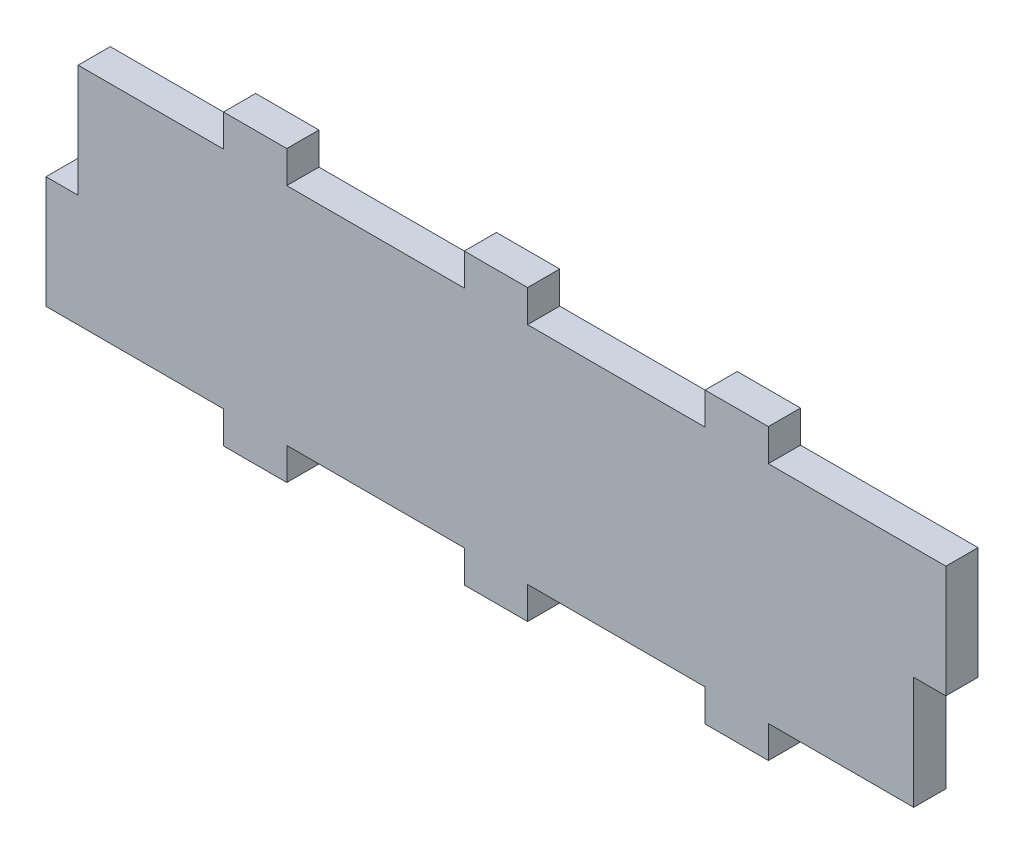
ISO-10303-21;
HEADER;
FILE_DESCRIPTION(('STEP AP214'),'2;1');
FILE_NAME('part.step','',(''),(''),'','','');
FILE_SCHEMA(('AUTOMOTIVE_DESIGN { 1 0 10303 214 1 1 1 1 }'));
ENDSEC;
DATA;
#1=APPLICATION_CONTEXT('core data for automotive mechanical design processes');
#2=APPLICATION_PROTOCOL_DEFINITION('international standard','automotive_design',2000,#1);
#3=PRODUCT_CONTEXT('',#1,'mechanical');
#4=PRODUCT('Part','Part','',(#3));
#5=PRODUCT_RELATED_PRODUCT_CATEGORY('part','',(#4));
#6=PRODUCT_DEFINITION_FORMATION('','',#4);
#7=PRODUCT_DEFINITION_CONTEXT('part definition',#1,'design');
#8=PRODUCT_DEFINITION('design','',#6,#7);
#9=PRODUCT_DEFINITION_SHAPE('','',#8);
#10=(LENGTH_UNIT() NAMED_UNIT(*) SI_UNIT(.MILLI.,.METRE.));
#11=(NAMED_UNIT(*) PLANE_ANGLE_UNIT() SI_UNIT($,.RADIAN.));
#12=(NAMED_UNIT(*) SI_UNIT($,.STERADIAN.) SOLID_ANGLE_UNIT());
#13=UNCERTAINTY_MEASURE_WITH_UNIT(LENGTH_MEASURE(1.E-05),#10,'distance_accuracy_value','');
#14=(GEOMETRIC_REPRESENTATION_CONTEXT(3) GLOBAL_UNCERTAINTY_ASSIGNED_CONTEXT((#13)) GLOBAL_UNIT_ASSIGNED_CONTEXT((#10,
#11,#12)) REPRESENTATION_CONTEXT('',''));
#15=CARTESIAN_POINT('',(0.,0.,0.));
#16=DIRECTION('',(0.,0.,1.));
#17=DIRECTION('',(1.,0.,0.));
#18=AXIS2_PLACEMENT_3D('',#15,#16,#17);
#19=CARTESIAN_POINT('',(0.,-17.5,5.));
#20=DIRECTION('',(0.,1.,0.));
#21=DIRECTION('',(-1.,0.,0.));
#22=AXIS2_PLACEMENT_3D('',#19,#20,#21);
#23=PLANE('',#22);
#24=DIRECTION('',(1.,0.,0.));
#25=VECTOR('',#24,1.);
#26=CARTESIAN_POINT('',(0.,-17.5,0.));
#27=LINE('',#26,#25);
#28=CARTESIAN_POINT('',(-70.,-17.5,0.));
#29=VERTEX_POINT('',#28);
#30=CARTESIAN_POINT('',(-42.3875,-17.5,0.));
#31=VERTEX_POINT('',#30);
#32=EDGE_CURVE('E281',#29,#31,#27,.T.);
#33=ORIENTED_EDGE('',*,*,#32,.T.);
#34=DIRECTION('',(0.,0.,-1.));
#35=VECTOR('',#34,1.);
#36=CARTESIAN_POINT('',(-42.3875,-17.5,5.));
#37=LINE('',#36,#35);
#38=CARTESIAN_POINT('',(-42.3875,-17.5,5.));
#39=VERTEX_POINT('',#38);
#40=EDGE_CURVE('E11',#39,#31,#37,.T.);
#41=ORIENTED_EDGE('',*,*,#40,.F.);
#42=DIRECTION('',(1.,0.,0.));
#43=VECTOR('',#42,1.);
#44=CARTESIAN_POINT('',(0.,-17.5,5.));
#45=LINE('',#44,#43);
#46=CARTESIAN_POINT('',(-70.,-17.5,5.));
#47=VERTEX_POINT('',#46);
#48=EDGE_CURVE('E357',#47,#39,#45,.T.);
#49=ORIENTED_EDGE('',*,*,#48,.F.);
#50=DIRECTION('',(0.,0.,-1.));
#51=VECTOR('',#50,1.);
#52=CARTESIAN_POINT('',(-70.,-17.5,5.));
#53=LINE('',#52,#51);
#54=EDGE_CURVE('E52',#47,#29,#53,.T.);
#55=ORIENTED_EDGE('',*,*,#54,.T.);
#56=EDGE_LOOP('',(#33,#41,#49,#55));
#57=FACE_BOUND('',#56,.T.);
#58=ADVANCED_FACE('F35',(#57),#23,.F.);
#59=CARTESIAN_POINT('',(-42.3875,0.,5.));
#60=DIRECTION('',(1.,0.,0.));
#61=DIRECTION('',(0.,0.,-1.));
#62=AXIS2_PLACEMENT_3D('',#59,#60,#61);
#63=PLANE('',#62);
#64=DIRECTION('',(0.,-1.,0.));
#65=VECTOR('',#64,1.);
#66=CARTESIAN_POINT('',(-42.3875,0.,0.));
#67=LINE('',#66,#65);
#68=CARTESIAN_POINT('',(-42.3875,-22.5,0.));
#69=VERTEX_POINT('',#68);
#70=EDGE_CURVE('E283',#31,#69,#67,.T.);
#71=ORIENTED_EDGE('',*,*,#70,.T.);
#72=DIRECTION('',(0.,0.,-1.));
#73=VECTOR('',#72,1.);
#74=CARTESIAN_POINT('',(-42.3875,-22.5,5.));
#75=LINE('',#74,#73);
#76=CARTESIAN_POINT('',(-42.3875,-22.5,5.));
#77=VERTEX_POINT('',#76);
#78=EDGE_CURVE('E44',#77,#69,#75,.T.);
#79=ORIENTED_EDGE('',*,*,#78,.F.);
#80=DIRECTION('',(0.,-1.,0.));
#81=VECTOR('',#80,1.);
#82=CARTESIAN_POINT('',(-42.3875,0.,5.));
#83=LINE('',#82,#81);
#84=EDGE_CURVE('E163',#39,#77,#83,.T.);
#85=ORIENTED_EDGE('',*,*,#84,.F.);
#86=ORIENTED_EDGE('',*,*,#40,.T.);
#87=EDGE_LOOP('',(#71,#79,#85,#86));
#88=FACE_BOUND('',#87,.T.);
#89=ADVANCED_FACE('F37',(#88),#63,.F.);
#90=CARTESIAN_POINT('',(0.,-22.5,5.));
#91=DIRECTION('',(0.,1.,0.));
#92=DIRECTION('',(0.,0.,1.));
#93=AXIS2_PLACEMENT_3D('',#90,#91,#92);
#94=PLANE('',#93);
#95=DIRECTION('',(1.,0.,0.));
#96=VECTOR('',#95,1.);
#97=CARTESIAN_POINT('',(0.,-22.5,0.));
#98=LINE('',#97,#96);
#99=CARTESIAN_POINT('',(-32.5375,-22.5,0.));
#100=VERTEX_POINT('',#99);
#101=EDGE_CURVE('E287',#69,#100,#98,.T.);
#102=ORIENTED_EDGE('',*,*,#101,.T.);
#103=DIRECTION('',(0.,0.,-1.));
#104=VECTOR('',#103,1.);
#105=CARTESIAN_POINT('',(-32.5375,-22.5,5.));
#106=LINE('',#105,#104);
#107=CARTESIAN_POINT('',(-32.5375,-22.5,5.));
#108=VERTEX_POINT('',#107);
#109=EDGE_CURVE('E417',#108,#100,#106,.T.);
#110=ORIENTED_EDGE('',*,*,#109,.F.);
#111=DIRECTION('',(1.,0.,0.));
#112=VECTOR('',#111,1.);
#113=CARTESIAN_POINT('',(0.,-22.5,5.));
#114=LINE('',#113,#112);
#115=EDGE_CURVE('E424',#77,#108,#114,.T.);
#116=ORIENTED_EDGE('',*,*,#115,.F.);
#117=ORIENTED_EDGE('',*,*,#78,.T.);
#118=EDGE_LOOP('',(#102,#110,#116,#117));
#119=FACE_BOUND('',#118,.T.);
#120=ADVANCED_FACE('F422',(#119),#94,.F.);
#121=CARTESIAN_POINT('',(-32.5375,0.,5.));
#122=DIRECTION('',(1.,0.,0.));
#123=DIRECTION('',(0.,0.,-1.));
#124=AXIS2_PLACEMENT_3D('',#121,#122,#123);
#125=PLANE('',#124);
#126=DIRECTION('',(0.,-1.,0.));
#127=VECTOR('',#126,1.);
#128=CARTESIAN_POINT('',(-32.5375,0.,0.));
#129=LINE('',#128,#127);
#130=CARTESIAN_POINT('',(-32.5375,-17.5,0.));
#131=VERTEX_POINT('',#130);
#132=EDGE_CURVE('E290',#131,#100,#129,.T.);
#133=ORIENTED_EDGE('',*,*,#132,.F.);
#134=DIRECTION('',(0.,0.,-1.));
#135=VECTOR('',#134,1.);
#136=CARTESIAN_POINT('',(-32.5375,-17.5,5.));
#137=LINE('',#136,#135);
#138=CARTESIAN_POINT('',(-32.5375,-17.5,5.));
#139=VERTEX_POINT('',#138);
#140=EDGE_CURVE('E415',#139,#131,#137,.T.);
#141=ORIENTED_EDGE('',*,*,#140,.F.);
#142=DIRECTION('',(0.,-1.,0.));
#143=VECTOR('',#142,1.);
#144=CARTESIAN_POINT('',(-32.5375,0.,5.));
#145=LINE('',#144,#143);
#146=EDGE_CURVE('E435',#139,#108,#145,.T.);
#147=ORIENTED_EDGE('',*,*,#146,.T.);
#148=ORIENTED_EDGE('',*,*,#109,.T.);
#149=EDGE_LOOP('',(#133,#141,#147,#148));
#150=FACE_BOUND('',#149,.T.);
#151=ADVANCED_FACE('F431',(#150),#125,.T.);
#152=CARTESIAN_POINT('',(-4.92499999999999,-17.5,0.));
#153=VERTEX_POINT('',#152);
#154=EDGE_CURVE('E285',#131,#153,#27,.T.);
#155=ORIENTED_EDGE('',*,*,#154,.T.);
#156=DIRECTION('',(0.,0.,-1.));
#157=VECTOR('',#156,1.);
#158=CARTESIAN_POINT('',(-4.92499999999999,-17.5,5.));
#159=LINE('',#158,#157);
#160=CARTESIAN_POINT('',(-4.92499999999999,-17.5,5.));
#161=VERTEX_POINT('',#160);
#162=EDGE_CURVE('E412',#161,#153,#159,.T.);
#163=ORIENTED_EDGE('',*,*,#162,.F.);
#164=EDGE_CURVE('E436',#139,#161,#45,.T.);
#165=ORIENTED_EDGE('',*,*,#164,.F.);
#166=ORIENTED_EDGE('',*,*,#140,.T.);
#167=EDGE_LOOP('',(#155,#163,#165,#166));
#168=FACE_BOUND('',#167,.T.);
#169=ADVANCED_FACE('F511',(#168),#23,.F.);
#170=CARTESIAN_POINT('',(-4.92499999999999,0.,5.));
#171=DIRECTION('',(1.,0.,0.));
#172=DIRECTION('',(0.,0.,-1.));
#173=AXIS2_PLACEMENT_3D('',#170,#171,#172);
#174=PLANE('',#173);
#175=DIRECTION('',(0.,-1.,0.));
#176=VECTOR('',#175,1.);
#177=CARTESIAN_POINT('',(-4.92499999999999,0.,0.));
#178=LINE('',#177,#176);
#179=CARTESIAN_POINT('',(-4.92499999999999,-22.5,0.));
#180=VERTEX_POINT('',#179);
#181=EDGE_CURVE('E293',#153,#180,#178,.T.);
#182=ORIENTED_EDGE('',*,*,#181,.T.);
#183=DIRECTION('',(0.,0.,-1.));
#184=VECTOR('',#183,1.);
#185=CARTESIAN_POINT('',(-4.92499999999999,-22.5,5.));
#186=LINE('',#185,#184);
#187=CARTESIAN_POINT('',(-4.92499999999999,-22.5,5.));
#188=VERTEX_POINT('',#187);
#189=EDGE_CURVE('E409',#188,#180,#186,.T.);
#190=ORIENTED_EDGE('',*,*,#189,.F.);
#191=DIRECTION('',(0.,-1.,0.));
#192=VECTOR('',#191,1.);
#193=CARTESIAN_POINT('',(-4.92499999999999,0.,5.));
#194=LINE('',#193,#192);
#195=EDGE_CURVE('E438',#161,#188,#194,.T.);
#196=ORIENTED_EDGE('',*,*,#195,.F.);
#197=ORIENTED_EDGE('',*,*,#162,.T.);
#198=EDGE_LOOP('',(#182,#190,#196,#197));
#199=FACE_BOUND('',#198,.T.);
#200=ADVANCED_FACE('F519',(#199),#174,.F.);
#201=CARTESIAN_POINT('',(0.,-22.5,5.));
#202=DIRECTION('',(0.,1.,0.));
#203=DIRECTION('',(0.,0.,1.));
#204=AXIS2_PLACEMENT_3D('',#201,#202,#203);
#205=PLANE('',#204);
#206=DIRECTION('',(1.,0.,0.));
#207=VECTOR('',#206,1.);
#208=CARTESIAN_POINT('',(0.,-22.5,0.));
#209=LINE('',#208,#207);
#210=CARTESIAN_POINT('',(4.92500000000001,-22.5,0.));
#211=VERTEX_POINT('',#210);
#212=EDGE_CURVE('E295',#180,#211,#209,.T.);
#213=ORIENTED_EDGE('',*,*,#212,.T.);
#214=DIRECTION('',(0.,0.,-1.));
#215=VECTOR('',#214,1.);
#216=CARTESIAN_POINT('',(4.92500000000001,-22.5,5.));
#217=LINE('',#216,#215);
#218=CARTESIAN_POINT('',(4.92500000000001,-22.5,5.));
#219=VERTEX_POINT('',#218);
#220=EDGE_CURVE('E407',#219,#211,#217,.T.);
#221=ORIENTED_EDGE('',*,*,#220,.F.);
#222=DIRECTION('',(1.,0.,0.));
#223=VECTOR('',#222,1.);
#224=CARTESIAN_POINT('',(0.,-22.5,5.));
#225=LINE('',#224,#223);
#226=EDGE_CURVE('E445',#188,#219,#225,.T.);
#227=ORIENTED_EDGE('',*,*,#226,.F.);
#228=ORIENTED_EDGE('',*,*,#189,.T.);
#229=EDGE_LOOP('',(#213,#221,#227,#228));
#230=FACE_BOUND('',#229,.T.);
#231=ADVANCED_FACE('F544',(#230),#205,.F.);
#232=CARTESIAN_POINT('',(4.92500000000001,0.,5.));
#233=DIRECTION('',(1.,0.,0.));
#234=DIRECTION('',(0.,0.,-1.));
#235=AXIS2_PLACEMENT_3D('',#232,#233,#234);
#236=PLANE('',#235);
#237=DIRECTION('',(0.,-1.,0.));
#238=VECTOR('',#237,1.);
#239=CARTESIAN_POINT('',(4.92500000000001,0.,0.));
#240=LINE('',#239,#238);
#241=CARTESIAN_POINT('',(4.92500000000001,-17.5,0.));
#242=VERTEX_POINT('',#241);
#243=EDGE_CURVE('E298',#242,#211,#240,.T.);
#244=ORIENTED_EDGE('',*,*,#243,.F.);
#245=DIRECTION('',(0.,0.,-1.));
#246=VECTOR('',#245,1.);
#247=CARTESIAN_POINT('',(4.92500000000001,-17.5,5.));
#248=LINE('',#247,#246);
#249=CARTESIAN_POINT('',(4.92500000000001,-17.5,5.));
#250=VERTEX_POINT('',#249);
#251=EDGE_CURVE('E405',#250,#242,#248,.T.);
#252=ORIENTED_EDGE('',*,*,#251,.F.);
#253=DIRECTION('',(0.,-1.,0.));
#254=VECTOR('',#253,1.);
#255=CARTESIAN_POINT('',(4.92500000000001,0.,5.));
#256=LINE('',#255,#254);
#257=EDGE_CURVE('E447',#250,#219,#256,.T.);
#258=ORIENTED_EDGE('',*,*,#257,.T.);
#259=ORIENTED_EDGE('',*,*,#220,.T.);
#260=EDGE_LOOP('',(#244,#252,#258,#259));
#261=FACE_BOUND('',#260,.T.);
#262=ADVANCED_FACE('F536',(#261),#236,.T.);
#263=CARTESIAN_POINT('',(32.5375,-17.5,0.));
#264=VERTEX_POINT('',#263);
#265=EDGE_CURVE('E301',#242,#264,#27,.T.);
#266=ORIENTED_EDGE('',*,*,#265,.T.);
#267=DIRECTION('',(0.,0.,-1.));
#268=VECTOR('',#267,1.);
#269=CARTESIAN_POINT('',(32.5375,-17.5,5.));
#270=LINE('',#269,#268);
#271=CARTESIAN_POINT('',(32.5375,-17.5,5.));
#272=VERTEX_POINT('',#271);
#273=EDGE_CURVE('E402',#272,#264,#270,.T.);
#274=ORIENTED_EDGE('',*,*,#273,.F.);
#275=EDGE_CURVE('E440',#250,#272,#45,.T.);
#276=ORIENTED_EDGE('',*,*,#275,.F.);
#277=ORIENTED_EDGE('',*,*,#251,.T.);
#278=EDGE_LOOP('',(#266,#274,#276,#277));
#279=FACE_BOUND('',#278,.T.);
#280=ADVANCED_FACE('F521',(#279),#23,.F.);
#281=CARTESIAN_POINT('',(32.5375,0.,5.));
#282=DIRECTION('',(1.,0.,0.));
#283=DIRECTION('',(0.,0.,-1.));
#284=AXIS2_PLACEMENT_3D('',#281,#282,#283);
#285=PLANE('',#284);
#286=DIRECTION('',(0.,-1.,0.));
#287=VECTOR('',#286,1.);
#288=CARTESIAN_POINT('',(32.5375,0.,0.));
#289=LINE('',#288,#287);
#290=CARTESIAN_POINT('',(32.5375,-22.5,0.));
#291=VERTEX_POINT('',#290);
#292=EDGE_CURVE('E302',#264,#291,#289,.T.);
#293=ORIENTED_EDGE('',*,*,#292,.T.);
#294=DIRECTION('',(0.,0.,-1.));
#295=VECTOR('',#294,1.);
#296=CARTESIAN_POINT('',(32.5375,-22.5,5.));
#297=LINE('',#296,#295);
#298=CARTESIAN_POINT('',(32.5375,-22.5,5.));
#299=VERTEX_POINT('',#298);
#300=EDGE_CURVE('E399',#299,#291,#297,.T.);
#301=ORIENTED_EDGE('',*,*,#300,.F.);
#302=DIRECTION('',(0.,-1.,0.));
#303=VECTOR('',#302,1.);
#304=CARTESIAN_POINT('',(32.5375,0.,5.));
#305=LINE('',#304,#303);
#306=EDGE_CURVE('E450',#272,#299,#305,.T.);
#307=ORIENTED_EDGE('',*,*,#306,.F.);
#308=ORIENTED_EDGE('',*,*,#273,.T.);
#309=EDGE_LOOP('',(#293,#301,#307,#308));
#310=FACE_BOUND('',#309,.T.);
#311=ADVANCED_FACE('F535',(#310),#285,.F.);
#312=CARTESIAN_POINT('',(0.,-22.5,5.));
#313=DIRECTION('',(0.,1.,0.));
#314=DIRECTION('',(0.,0.,1.));
#315=AXIS2_PLACEMENT_3D('',#312,#313,#314);
#316=PLANE('',#315);
#317=DIRECTION('',(1.,0.,0.));
#318=VECTOR('',#317,1.);
#319=CARTESIAN_POINT('',(0.,-22.5,0.));
#320=LINE('',#319,#318);
#321=CARTESIAN_POINT('',(42.3875,-22.5,0.));
#322=VERTEX_POINT('',#321);
#323=EDGE_CURVE('E304',#291,#322,#320,.T.);
#324=ORIENTED_EDGE('',*,*,#323,.T.);
#325=DIRECTION('',(0.,0.,-1.));
#326=VECTOR('',#325,1.);
#327=CARTESIAN_POINT('',(42.3875,-22.5,5.));
#328=LINE('',#327,#326);
#329=CARTESIAN_POINT('',(42.3875,-22.5,5.));
#330=VERTEX_POINT('',#329);
#331=EDGE_CURVE('E397',#330,#322,#328,.T.);
#332=ORIENTED_EDGE('',*,*,#331,.F.);
#333=DIRECTION('',(1.,0.,0.));
#334=VECTOR('',#333,1.);
#335=CARTESIAN_POINT('',(0.,-22.5,5.));
#336=LINE('',#335,#334);
#337=EDGE_CURVE('E452',#299,#330,#336,.T.);
#338=ORIENTED_EDGE('',*,*,#337,.F.);
#339=ORIENTED_EDGE('',*,*,#300,.T.);
#340=EDGE_LOOP('',(#324,#332,#338,#339));
#341=FACE_BOUND('',#340,.T.);
#342=ADVANCED_FACE('F532',(#341),#316,.F.);
#343=CARTESIAN_POINT('',(42.3875,0.,5.));
#344=DIRECTION('',(1.,0.,0.));
#345=DIRECTION('',(0.,0.,-1.));
#346=AXIS2_PLACEMENT_3D('',#343,#344,#345);
#347=PLANE('',#346);
#348=DIRECTION('',(0.,-1.,0.));
#349=VECTOR('',#348,1.);
#350=CARTESIAN_POINT('',(42.3875,0.,0.));
#351=LINE('',#350,#349);
#352=CARTESIAN_POINT('',(42.3875,-17.5,0.));
#353=VERTEX_POINT('',#352);
#354=EDGE_CURVE('E307',#353,#322,#351,.T.);
#355=ORIENTED_EDGE('',*,*,#354,.F.);
#356=DIRECTION('',(0.,0.,-1.));
#357=VECTOR('',#356,1.);
#358=CARTESIAN_POINT('',(42.3875,-17.5,5.));
#359=LINE('',#358,#357);
#360=CARTESIAN_POINT('',(42.3875,-17.5,5.));
#361=VERTEX_POINT('',#360);
#362=EDGE_CURVE('E395',#361,#353,#359,.T.);
#363=ORIENTED_EDGE('',*,*,#362,.F.);
#364=DIRECTION('',(0.,-1.,0.));
#365=VECTOR('',#364,1.);
#366=CARTESIAN_POINT('',(42.3875,0.,5.));
#367=LINE('',#366,#365);
#368=EDGE_CURVE('E454',#361,#330,#367,.T.);
#369=ORIENTED_EDGE('',*,*,#368,.T.);
#370=ORIENTED_EDGE('',*,*,#331,.T.);
#371=EDGE_LOOP('',(#355,#363,#369,#370));
#372=FACE_BOUND('',#371,.T.);
#373=ADVANCED_FACE('F524',(#372),#347,.T.);
#374=CARTESIAN_POINT('',(65.,-17.5,0.));
#375=VERTEX_POINT('',#374);
#376=EDGE_CURVE('E284',#353,#375,#27,.T.);
#377=ORIENTED_EDGE('',*,*,#376,.T.);
#378=DIRECTION('',(0.,0.,-1.));
#379=VECTOR('',#378,1.);
#380=CARTESIAN_POINT('',(65.,-17.5,5.));
#381=LINE('',#380,#379);
#382=CARTESIAN_POINT('',(65.,-17.5,5.));
#383=VERTEX_POINT('',#382);
#384=EDGE_CURVE('E392',#383,#375,#381,.T.);
#385=ORIENTED_EDGE('',*,*,#384,.F.);
#386=EDGE_CURVE('E457',#361,#383,#45,.T.);
#387=ORIENTED_EDGE('',*,*,#386,.F.);
#388=ORIENTED_EDGE('',*,*,#362,.T.);
#389=EDGE_LOOP('',(#377,#385,#387,#388));
#390=FACE_BOUND('',#389,.T.);
#391=ADVANCED_FACE('F512',(#390),#23,.F.);
#392=CARTESIAN_POINT('',(65.,0.,5.));
#393=DIRECTION('',(-1.,0.,0.));
#394=DIRECTION('',(0.,0.,1.));
#395=AXIS2_PLACEMENT_3D('',#392,#393,#394);
#396=PLANE('',#395);
#397=DIRECTION('',(0.,1.,0.));
#398=VECTOR('',#397,1.);
#399=CARTESIAN_POINT('',(65.,0.,0.));
#400=LINE('',#399,#398);
#401=CARTESIAN_POINT('',(65.,0.0249999999999972,0.));
#402=VERTEX_POINT('',#401);
#403=EDGE_CURVE('E310',#375,#402,#400,.T.);
#404=ORIENTED_EDGE('',*,*,#403,.T.);
#405=DIRECTION('',(0.,0.,-1.));
#406=VECTOR('',#405,1.);
#407=CARTESIAN_POINT('',(65.,0.0249999999999972,5.));
#408=LINE('',#407,#406);
#409=CARTESIAN_POINT('',(65.,0.0249999999999972,5.));
#410=VERTEX_POINT('',#409);
#411=EDGE_CURVE('E389',#410,#402,#408,.T.);
#412=ORIENTED_EDGE('',*,*,#411,.F.);
#413=DIRECTION('',(0.,1.,0.));
#414=VECTOR('',#413,1.);
#415=CARTESIAN_POINT('',(65.,0.,5.));
#416=LINE('',#415,#414);
#417=EDGE_CURVE('E458',#383,#410,#416,.T.);
#418=ORIENTED_EDGE('',*,*,#417,.F.);
#419=ORIENTED_EDGE('',*,*,#384,.T.);
#420=EDGE_LOOP('',(#404,#412,#418,#419));
#421=FACE_BOUND('',#420,.T.);
#422=ADVANCED_FACE('F523',(#421),#396,.F.);
#423=CARTESIAN_POINT('',(0.,0.0249999999999972,5.));
#424=DIRECTION('',(0.,1.,0.));
#425=DIRECTION('',(0.,0.,1.));
#426=AXIS2_PLACEMENT_3D('',#423,#424,#425);
#427=PLANE('',#426);
#428=DIRECTION('',(1.,0.,0.));
#429=VECTOR('',#428,1.);
#430=CARTESIAN_POINT('',(0.,0.0249999999999972,0.));
#431=LINE('',#430,#429);
#432=CARTESIAN_POINT('',(70.,0.0249999999999972,0.));
#433=VERTEX_POINT('',#432);
#434=EDGE_CURVE('E312',#402,#433,#431,.T.);
#435=ORIENTED_EDGE('',*,*,#434,.T.);
#436=DIRECTION('',(0.,0.,-1.));
#437=VECTOR('',#436,1.);
#438=CARTESIAN_POINT('',(70.,0.0249999999999972,5.));
#439=LINE('',#438,#437);
#440=CARTESIAN_POINT('',(70.,0.0249999999999972,5.));
#441=VERTEX_POINT('',#440);
#442=EDGE_CURVE('E387',#441,#433,#439,.T.);
#443=ORIENTED_EDGE('',*,*,#442,.F.);
#444=DIRECTION('',(1.,0.,0.));
#445=VECTOR('',#444,1.);
#446=CARTESIAN_POINT('',(0.,0.0249999999999972,5.));
#447=LINE('',#446,#445);
#448=EDGE_CURVE('E460',#410,#441,#447,.T.);
#449=ORIENTED_EDGE('',*,*,#448,.F.);
#450=ORIENTED_EDGE('',*,*,#411,.T.);
#451=EDGE_LOOP('',(#435,#443,#449,#450));
#452=FACE_BOUND('',#451,.T.);
#453=ADVANCED_FACE('F530',(#452),#427,.F.);
#454=CARTESIAN_POINT('',(70.,0.,5.));
#455=DIRECTION('',(1.,0.,0.));
#456=DIRECTION('',(0.,0.,-1.));
#457=AXIS2_PLACEMENT_3D('',#454,#455,#456);
#458=PLANE('',#457);
#459=DIRECTION('',(0.,-1.,0.));
#460=VECTOR('',#459,1.);
#461=CARTESIAN_POINT('',(70.,0.,0.));
#462=LINE('',#461,#460);
#463=CARTESIAN_POINT('',(70.,17.5,0.));
#464=VERTEX_POINT('',#463);
#465=EDGE_CURVE('E315',#464,#433,#462,.T.);
#466=ORIENTED_EDGE('',*,*,#465,.F.);
#467=DIRECTION('',(0.,0.,-1.));
#468=VECTOR('',#467,1.);
#469=CARTESIAN_POINT('',(70.,17.5,5.));
#470=LINE('',#469,#468);
#471=CARTESIAN_POINT('',(70.,17.5,5.));
#472=VERTEX_POINT('',#471);
#473=EDGE_CURVE('E385',#472,#464,#470,.T.);
#474=ORIENTED_EDGE('',*,*,#473,.F.);
#475=DIRECTION('',(0.,-1.,0.));
#476=VECTOR('',#475,1.);
#477=CARTESIAN_POINT('',(70.,0.,5.));
#478=LINE('',#477,#476);
#479=EDGE_CURVE('E462',#472,#441,#478,.T.);
#480=ORIENTED_EDGE('',*,*,#479,.T.);
#481=ORIENTED_EDGE('',*,*,#442,.T.);
#482=EDGE_LOOP('',(#466,#474,#480,#481));
#483=FACE_BOUND('',#482,.T.);
#484=ADVANCED_FACE('F634',(#483),#458,.T.);
#485=CARTESIAN_POINT('',(0.,17.5,5.));
#486=DIRECTION('',(0.,1.,0.));
#487=DIRECTION('',(0.,0.,1.));
#488=AXIS2_PLACEMENT_3D('',#485,#486,#487);
#489=PLANE('',#488);
#490=DIRECTION('',(1.,0.,0.));
#491=VECTOR('',#490,1.);
#492=CARTESIAN_POINT('',(0.,17.5,0.));
#493=LINE('',#492,#491);
#494=CARTESIAN_POINT('',(42.3874999999999,17.5,0.));
#495=VERTEX_POINT('',#494);
#496=EDGE_CURVE('E318',#495,#464,#493,.T.);
#497=ORIENTED_EDGE('',*,*,#496,.F.);
#498=DIRECTION('',(0.,0.,-1.));
#499=VECTOR('',#498,1.);
#500=CARTESIAN_POINT('',(42.3874999999999,17.5,5.));
#501=LINE('',#500,#499);
#502=CARTESIAN_POINT('',(42.3874999999999,17.5,5.));
#503=VERTEX_POINT('',#502);
#504=EDGE_CURVE('E383',#503,#495,#501,.T.);
#505=ORIENTED_EDGE('',*,*,#504,.F.);
#506=DIRECTION('',(1.,0.,0.));
#507=VECTOR('',#506,1.);
#508=CARTESIAN_POINT('',(0.,17.5,5.));
#509=LINE('',#508,#507);
#510=EDGE_CURVE('E276',#503,#472,#509,.T.);
#511=ORIENTED_EDGE('',*,*,#510,.T.);
#512=ORIENTED_EDGE('',*,*,#473,.T.);
#513=EDGE_LOOP('',(#497,#505,#511,#512));
#514=FACE_BOUND('',#513,.T.);
#515=ADVANCED_FACE('F578',(#514),#489,.T.);
#516=CARTESIAN_POINT('',(42.3874999999999,0.,5.));
#517=DIRECTION('',(1.,0.,0.));
#518=DIRECTION('',(0.,0.,-1.));
#519=AXIS2_PLACEMENT_3D('',#516,#517,#518);
#520=PLANE('',#519);
#521=DIRECTION('',(0.,-1.,0.));
#522=VECTOR('',#521,1.);
#523=CARTESIAN_POINT('',(42.3874999999999,0.,0.));
#524=LINE('',#523,#522);
#525=CARTESIAN_POINT('',(42.3874999999999,22.5,0.));
#526=VERTEX_POINT('',#525);
#527=EDGE_CURVE('E321',#526,#495,#524,.T.);
#528=ORIENTED_EDGE('',*,*,#527,.F.);
#529=DIRECTION('',(0.,0.,-1.));
#530=VECTOR('',#529,1.);
#531=CARTESIAN_POINT('',(42.3874999999999,22.5,5.));
#532=LINE('',#531,#530);
#533=CARTESIAN_POINT('',(42.3874999999999,22.5,5.));
#534=VERTEX_POINT('',#533);
#535=EDGE_CURVE('E381',#534,#526,#532,.T.);
#536=ORIENTED_EDGE('',*,*,#535,.F.);
#537=DIRECTION('',(0.,-1.,0.));
#538=VECTOR('',#537,1.);
#539=CARTESIAN_POINT('',(42.3874999999999,0.,5.));
#540=LINE('',#539,#538);
#541=EDGE_CURVE('E466',#534,#503,#540,.T.);
#542=ORIENTED_EDGE('',*,*,#541,.T.);
#543=ORIENTED_EDGE('',*,*,#504,.T.);
#544=EDGE_LOOP('',(#528,#536,#542,#543));
#545=FACE_BOUND('',#544,.T.);
#546=ADVANCED_FACE('F582',(#545),#520,.T.);
#547=CARTESIAN_POINT('',(0.,22.5,5.));
#548=DIRECTION('',(0.,1.,0.));
#549=DIRECTION('',(-1.,0.,0.));
#550=AXIS2_PLACEMENT_3D('',#547,#548,#549);
#551=PLANE('',#550);
#552=DIRECTION('',(1.,0.,0.));
#553=VECTOR('',#552,1.);
#554=CARTESIAN_POINT('',(0.,22.5,0.));
#555=LINE('',#554,#553);
#556=CARTESIAN_POINT('',(32.5374999999999,22.5,0.));
#557=VERTEX_POINT('',#556);
#558=EDGE_CURVE('E326',#557,#526,#555,.T.);
#559=ORIENTED_EDGE('',*,*,#558,.F.);
#560=DIRECTION('',(0.,0.,-1.));
#561=VECTOR('',#560,1.);
#562=CARTESIAN_POINT('',(32.5374999999999,22.5,5.));
#563=LINE('',#562,#561);
#564=CARTESIAN_POINT('',(32.5374999999999,22.5,5.));
#565=VERTEX_POINT('',#564);
#566=EDGE_CURVE('E379',#565,#557,#563,.T.);
#567=ORIENTED_EDGE('',*,*,#566,.F.);
#568=DIRECTION('',(1.,0.,0.));
#569=VECTOR('',#568,1.);
#570=CARTESIAN_POINT('',(0.,22.5,5.));
#571=LINE('',#570,#569);
#572=EDGE_CURVE('E470',#565,#534,#571,.T.);
#573=ORIENTED_EDGE('',*,*,#572,.T.);
#574=ORIENTED_EDGE('',*,*,#535,.T.);
#575=EDGE_LOOP('',(#559,#567,#573,#574));
#576=FACE_BOUND('',#575,.T.);
#577=ADVANCED_FACE('F586',(#576),#551,.T.);
#578=CARTESIAN_POINT('',(32.5374999999999,0.,5.));
#579=DIRECTION('',(1.,0.,0.));
#580=DIRECTION('',(0.,0.,-1.));
#581=AXIS2_PLACEMENT_3D('',#578,#579,#580);
#582=PLANE('',#581);
#583=DIRECTION('',(0.,-1.,0.));
#584=VECTOR('',#583,1.);
#585=CARTESIAN_POINT('',(32.5374999999999,0.,0.));
#586=LINE('',#585,#584);
#587=CARTESIAN_POINT('',(32.5374999999999,17.5,0.));
#588=VERTEX_POINT('',#587);
#589=EDGE_CURVE('E329',#557,#588,#586,.T.);
#590=ORIENTED_EDGE('',*,*,#589,.T.);
#591=DIRECTION('',(0.,0.,-1.));
#592=VECTOR('',#591,1.);
#593=CARTESIAN_POINT('',(32.5374999999999,17.5,5.));
#594=LINE('',#593,#592);
#595=CARTESIAN_POINT('',(32.5374999999999,17.5,5.));
#596=VERTEX_POINT('',#595);
#597=EDGE_CURVE('E377',#596,#588,#594,.T.);
#598=ORIENTED_EDGE('',*,*,#597,.F.);
#599=DIRECTION('',(0.,-1.,0.));
#600=VECTOR('',#599,1.);
#601=CARTESIAN_POINT('',(32.5374999999999,0.,5.));
#602=LINE('',#601,#600);
#603=EDGE_CURVE('E473',#565,#596,#602,.T.);
#604=ORIENTED_EDGE('',*,*,#603,.F.);
#605=ORIENTED_EDGE('',*,*,#566,.T.);
#606=EDGE_LOOP('',(#590,#598,#604,#605));
#607=FACE_BOUND('',#606,.T.);
#608=ADVANCED_FACE('F591',(#607),#582,.F.);
#609=CARTESIAN_POINT('',(4.92499999999987,17.5,0.));
#610=VERTEX_POINT('',#609);
#611=EDGE_CURVE('E323',#610,#588,#493,.T.);
#612=ORIENTED_EDGE('',*,*,#611,.F.);
#613=DIRECTION('',(0.,0.,-1.));
#614=VECTOR('',#613,1.);
#615=CARTESIAN_POINT('',(4.92499999999987,17.5,5.));
#616=LINE('',#615,#614);
#617=CARTESIAN_POINT('',(4.92499999999987,17.5,5.));
#618=VERTEX_POINT('',#617);
#619=EDGE_CURVE('E375',#618,#610,#616,.T.);
#620=ORIENTED_EDGE('',*,*,#619,.F.);
#621=EDGE_CURVE('E467',#618,#596,#509,.T.);
#622=ORIENTED_EDGE('',*,*,#621,.T.);
#623=ORIENTED_EDGE('',*,*,#597,.T.);
#624=EDGE_LOOP('',(#612,#620,#622,#623));
#625=FACE_BOUND('',#624,.T.);
#626=ADVANCED_FACE('F621',(#625),#489,.T.);
#627=CARTESIAN_POINT('',(4.92499999999987,0.,5.));
#628=DIRECTION('',(1.,0.,0.));
#629=DIRECTION('',(0.,0.,-1.));
#630=AXIS2_PLACEMENT_3D('',#627,#628,#629);
#631=PLANE('',#630);
#632=DIRECTION('',(0.,-1.,0.));
#633=VECTOR('',#632,1.);
#634=CARTESIAN_POINT('',(4.92499999999987,0.,0.));
#635=LINE('',#634,#633);
#636=CARTESIAN_POINT('',(4.92499999999987,22.5,0.));
#637=VERTEX_POINT('',#636);
#638=EDGE_CURVE('E332',#637,#610,#635,.T.);
#639=ORIENTED_EDGE('',*,*,#638,.F.);
#640=DIRECTION('',(0.,0.,-1.));
#641=VECTOR('',#640,1.);
#642=CARTESIAN_POINT('',(4.92499999999987,22.5,5.));
#643=LINE('',#642,#641);
#644=CARTESIAN_POINT('',(4.92499999999987,22.5,5.));
#645=VERTEX_POINT('',#644);
#646=EDGE_CURVE('E373',#645,#637,#643,.T.);
#647=ORIENTED_EDGE('',*,*,#646,.F.);
#648=DIRECTION('',(0.,-1.,0.));
#649=VECTOR('',#648,1.);
#650=CARTESIAN_POINT('',(4.92499999999987,0.,5.));
#651=LINE('',#650,#649);
#652=EDGE_CURVE('E475',#645,#618,#651,.T.);
#653=ORIENTED_EDGE('',*,*,#652,.T.);
#654=ORIENTED_EDGE('',*,*,#619,.T.);
#655=EDGE_LOOP('',(#639,#647,#653,#654));
#656=FACE_BOUND('',#655,.T.);
#657=ADVANCED_FACE('F599',(#656),#631,.T.);
#658=CARTESIAN_POINT('',(0.,22.5,5.));
#659=DIRECTION('',(0.,1.,0.));
#660=DIRECTION('',(-1.,0.,0.));
#661=AXIS2_PLACEMENT_3D('',#658,#659,#660);
#662=PLANE('',#661);
#663=DIRECTION('',(1.,0.,0.));
#664=VECTOR('',#663,1.);
#665=CARTESIAN_POINT('',(0.,22.5,0.));
#666=LINE('',#665,#664);
#667=CARTESIAN_POINT('',(-4.92500000000013,22.5,0.));
#668=VERTEX_POINT('',#667);
#669=EDGE_CURVE('E335',#668,#637,#666,.T.);
#670=ORIENTED_EDGE('',*,*,#669,.F.);
#671=DIRECTION('',(0.,0.,-1.));
#672=VECTOR('',#671,1.);
#673=CARTESIAN_POINT('',(-4.92500000000013,22.5,5.));
#674=LINE('',#673,#672);
#675=CARTESIAN_POINT('',(-4.92500000000013,22.5,5.));
#676=VERTEX_POINT('',#675);
#677=EDGE_CURVE('E371',#676,#668,#674,.T.);
#678=ORIENTED_EDGE('',*,*,#677,.F.);
#679=DIRECTION('',(1.,0.,0.));
#680=VECTOR('',#679,1.);
#681=CARTESIAN_POINT('',(0.,22.5,5.));
#682=LINE('',#681,#680);
#683=EDGE_CURVE('E478',#676,#645,#682,.T.);
#684=ORIENTED_EDGE('',*,*,#683,.T.);
#685=ORIENTED_EDGE('',*,*,#646,.T.);
#686=EDGE_LOOP('',(#670,#678,#684,#685));
#687=FACE_BOUND('',#686,.T.);
#688=ADVANCED_FACE('F603',(#687),#662,.T.);
#689=CARTESIAN_POINT('',(-4.92500000000013,0.,5.));
#690=DIRECTION('',(1.,0.,0.));
#691=DIRECTION('',(0.,0.,-1.));
#692=AXIS2_PLACEMENT_3D('',#689,#690,#691);
#693=PLANE('',#692);
#694=DIRECTION('',(0.,-1.,0.));
#695=VECTOR('',#694,1.);
#696=CARTESIAN_POINT('',(-4.92500000000013,0.,0.));
#697=LINE('',#696,#695);
#698=CARTESIAN_POINT('',(-4.92500000000013,17.5,0.));
#699=VERTEX_POINT('',#698);
#700=EDGE_CURVE('E338',#668,#699,#697,.T.);
#701=ORIENTED_EDGE('',*,*,#700,.T.);
#702=DIRECTION('',(0.,0.,-1.));
#703=VECTOR('',#702,1.);
#704=CARTESIAN_POINT('',(-4.92500000000013,17.5,5.));
#705=LINE('',#704,#703);
#706=CARTESIAN_POINT('',(-4.92500000000013,17.5,5.));
#707=VERTEX_POINT('',#706);
#708=EDGE_CURVE('E369',#707,#699,#705,.T.);
#709=ORIENTED_EDGE('',*,*,#708,.F.);
#710=DIRECTION('',(0.,-1.,0.));
#711=VECTOR('',#710,1.);
#712=CARTESIAN_POINT('',(-4.92500000000013,0.,5.));
#713=LINE('',#712,#711);
#714=EDGE_CURVE('E481',#676,#707,#713,.T.);
#715=ORIENTED_EDGE('',*,*,#714,.F.);
#716=ORIENTED_EDGE('',*,*,#677,.T.);
#717=EDGE_LOOP('',(#701,#709,#715,#716));
#718=FACE_BOUND('',#717,.T.);
#719=ADVANCED_FACE('F609',(#718),#693,.F.);
#720=CARTESIAN_POINT('',(-32.5375000000001,17.5,0.));
#721=VERTEX_POINT('',#720);
#722=EDGE_CURVE('E341',#721,#699,#493,.T.);
#723=ORIENTED_EDGE('',*,*,#722,.F.);
#724=DIRECTION('',(0.,0.,-1.));
#725=VECTOR('',#724,1.);
#726=CARTESIAN_POINT('',(-32.5375000000001,17.5,5.));
#727=LINE('',#726,#725);
#728=CARTESIAN_POINT('',(-32.5375000000001,17.5,5.));
#729=VERTEX_POINT('',#728);
#730=EDGE_CURVE('E367',#729,#721,#727,.T.);
#731=ORIENTED_EDGE('',*,*,#730,.F.);
#732=EDGE_CURVE('E275',#729,#707,#509,.T.);
#733=ORIENTED_EDGE('',*,*,#732,.T.);
#734=ORIENTED_EDGE('',*,*,#708,.T.);
#735=EDGE_LOOP('',(#723,#731,#733,#734));
#736=FACE_BOUND('',#735,.T.);
#737=ADVANCED_FACE('F614',(#736),#489,.T.);
#738=CARTESIAN_POINT('',(-32.5375000000001,0.,5.));
#739=DIRECTION('',(1.,0.,0.));
#740=DIRECTION('',(0.,0.,-1.));
#741=AXIS2_PLACEMENT_3D('',#738,#739,#740);
#742=PLANE('',#741);
#743=DIRECTION('',(0.,-1.,0.));
#744=VECTOR('',#743,1.);
#745=CARTESIAN_POINT('',(-32.5375000000001,0.,0.));
#746=LINE('',#745,#744);
#747=CARTESIAN_POINT('',(-32.5375000000001,22.5,0.));
#748=VERTEX_POINT('',#747);
#749=EDGE_CURVE('E342',#748,#721,#746,.T.);
#750=ORIENTED_EDGE('',*,*,#749,.F.);
#751=DIRECTION('',(0.,0.,-1.));
#752=VECTOR('',#751,1.);
#753=CARTESIAN_POINT('',(-32.5375000000001,22.5,5.));
#754=LINE('',#753,#752);
#755=CARTESIAN_POINT('',(-32.5375000000001,22.5,5.));
#756=VERTEX_POINT('',#755);
#757=EDGE_CURVE('E365',#756,#748,#754,.T.);
#758=ORIENTED_EDGE('',*,*,#757,.F.);
#759=DIRECTION('',(0.,-1.,0.));
#760=VECTOR('',#759,1.);
#761=CARTESIAN_POINT('',(-32.5375000000001,0.,5.));
#762=LINE('',#761,#760);
#763=EDGE_CURVE('E483',#756,#729,#762,.T.);
#764=ORIENTED_EDGE('',*,*,#763,.T.);
#765=ORIENTED_EDGE('',*,*,#730,.T.);
#766=EDGE_LOOP('',(#750,#758,#764,#765));
#767=FACE_BOUND('',#766,.T.);
#768=ADVANCED_FACE('F617',(#767),#742,.T.);
#769=CARTESIAN_POINT('',(0.,22.5,5.));
#770=DIRECTION('',(0.,1.,0.));
#771=DIRECTION('',(-1.,0.,0.));
#772=AXIS2_PLACEMENT_3D('',#769,#770,#771);
#773=PLANE('',#772);
#774=DIRECTION('',(1.,0.,0.));
#775=VECTOR('',#774,1.);
#776=CARTESIAN_POINT('',(0.,22.5,0.));
#777=LINE('',#776,#775);
#778=CARTESIAN_POINT('',(-42.3875000000001,22.5,0.));
#779=VERTEX_POINT('',#778);
#780=EDGE_CURVE('E345',#779,#748,#777,.T.);
#781=ORIENTED_EDGE('',*,*,#780,.F.);
#782=DIRECTION('',(0.,0.,-1.));
#783=VECTOR('',#782,1.);
#784=CARTESIAN_POINT('',(-42.3875000000001,22.5,5.));
#785=LINE('',#784,#783);
#786=CARTESIAN_POINT('',(-42.3875000000001,22.5,5.));
#787=VERTEX_POINT('',#786);
#788=EDGE_CURVE('E363',#787,#779,#785,.T.);
#789=ORIENTED_EDGE('',*,*,#788,.F.);
#790=DIRECTION('',(1.,0.,0.));
#791=VECTOR('',#790,1.);
#792=CARTESIAN_POINT('',(0.,22.5,5.));
#793=LINE('',#792,#791);
#794=EDGE_CURVE('E485',#787,#756,#793,.T.);
#795=ORIENTED_EDGE('',*,*,#794,.T.);
#796=ORIENTED_EDGE('',*,*,#757,.T.);
#797=EDGE_LOOP('',(#781,#789,#795,#796));
#798=FACE_BOUND('',#797,.T.);
#799=ADVANCED_FACE('F619',(#798),#773,.T.);
#800=CARTESIAN_POINT('',(-42.3875000000001,0.,5.));
#801=DIRECTION('',(1.,0.,0.));
#802=DIRECTION('',(0.,0.,-1.));
#803=AXIS2_PLACEMENT_3D('',#800,#801,#802);
#804=PLANE('',#803);
#805=DIRECTION('',(0.,-1.,0.));
#806=VECTOR('',#805,1.);
#807=CARTESIAN_POINT('',(-42.3875000000001,0.,0.));
#808=LINE('',#807,#806);
#809=CARTESIAN_POINT('',(-42.3875000000001,17.5,0.));
#810=VERTEX_POINT('',#809);
#811=EDGE_CURVE('E348',#779,#810,#808,.T.);
#812=ORIENTED_EDGE('',*,*,#811,.T.);
#813=DIRECTION('',(0.,0.,-1.));
#814=VECTOR('',#813,1.);
#815=CARTESIAN_POINT('',(-42.3875000000001,17.5,5.));
#816=LINE('',#815,#814);
#817=CARTESIAN_POINT('',(-42.3875000000001,17.5,5.));
#818=VERTEX_POINT('',#817);
#819=EDGE_CURVE('E361',#818,#810,#816,.T.);
#820=ORIENTED_EDGE('',*,*,#819,.F.);
#821=DIRECTION('',(0.,-1.,0.));
#822=VECTOR('',#821,1.);
#823=CARTESIAN_POINT('',(-42.3875000000001,0.,5.));
#824=LINE('',#823,#822);
#825=EDGE_CURVE('E273',#787,#818,#824,.T.);
#826=ORIENTED_EDGE('',*,*,#825,.F.);
#827=ORIENTED_EDGE('',*,*,#788,.T.);
#828=EDGE_LOOP('',(#812,#820,#826,#827));
#829=FACE_BOUND('',#828,.T.);
#830=ADVANCED_FACE('F493',(#829),#804,.F.);
#831=CARTESIAN_POINT('',(-65.,17.5,0.));
#832=VERTEX_POINT('',#831);
#833=EDGE_CURVE('E322',#832,#810,#493,.T.);
#834=ORIENTED_EDGE('',*,*,#833,.F.);
#835=DIRECTION('',(0.,0.,-1.));
#836=VECTOR('',#835,1.);
#837=CARTESIAN_POINT('',(-65.,17.5,5.));
#838=LINE('',#837,#836);
#839=CARTESIAN_POINT('',(-65.,17.5,5.));
#840=VERTEX_POINT('',#839);
#841=EDGE_CURVE('E260',#840,#832,#838,.T.);
#842=ORIENTED_EDGE('',*,*,#841,.F.);
#843=EDGE_CURVE('E271',#840,#818,#509,.T.);
#844=ORIENTED_EDGE('',*,*,#843,.T.);
#845=ORIENTED_EDGE('',*,*,#819,.T.);
#846=EDGE_LOOP('',(#834,#842,#844,#845));
#847=FACE_BOUND('',#846,.T.);
#848=ADVANCED_FACE('F498',(#847),#489,.T.);
#849=CARTESIAN_POINT('',(-65.,0.,5.));
#850=DIRECTION('',(-1.,0.,0.));
#851=DIRECTION('',(0.,0.,1.));
#852=AXIS2_PLACEMENT_3D('',#849,#850,#851);
#853=PLANE('',#852);
#854=DIRECTION('',(0.,1.,0.));
#855=VECTOR('',#854,1.);
#856=CARTESIAN_POINT('',(-65.,0.,0.));
#857=LINE('',#856,#855);
#858=CARTESIAN_POINT('',(-65.,-0.0250000000000053,0.));
#859=VERTEX_POINT('',#858);
#860=EDGE_CURVE('E257',#859,#832,#857,.T.);
#861=ORIENTED_EDGE('',*,*,#860,.F.);
#862=DIRECTION('',(0.,0.,-1.));
#863=VECTOR('',#862,1.);
#864=CARTESIAN_POINT('',(-65.,-0.0250000000000053,5.));
#865=LINE('',#864,#863);
#866=CARTESIAN_POINT('',(-65.,-0.0250000000000053,5.));
#867=VERTEX_POINT('',#866);
#868=EDGE_CURVE('E251',#867,#859,#865,.T.);
#869=ORIENTED_EDGE('',*,*,#868,.F.);
#870=DIRECTION('',(0.,1.,0.));
#871=VECTOR('',#870,1.);
#872=CARTESIAN_POINT('',(-65.,0.,5.));
#873=LINE('',#872,#871);
#874=EDGE_CURVE('E255',#867,#840,#873,.T.);
#875=ORIENTED_EDGE('',*,*,#874,.T.);
#876=ORIENTED_EDGE('',*,*,#841,.T.);
#877=EDGE_LOOP('',(#861,#869,#875,#876));
#878=FACE_BOUND('',#877,.T.);
#879=ADVANCED_FACE('F253',(#878),#853,.T.);
#880=CARTESIAN_POINT('',(0.,-0.0250000000000192,5.));
#881=DIRECTION('',(0.,-1.,0.));
#882=DIRECTION('',(1.,0.,0.));
#883=AXIS2_PLACEMENT_3D('',#880,#881,#882);
#884=PLANE('',#883);
#885=DIRECTION('',(-1.,0.,0.));
#886=VECTOR('',#885,1.);
#887=CARTESIAN_POINT('',(0.,-0.0250000000000192,0.));
#888=LINE('',#887,#886);
#889=CARTESIAN_POINT('',(-70.,-0.0250000000000042,0.));
#890=VERTEX_POINT('',#889);
#891=EDGE_CURVE('E352',#859,#890,#888,.T.);
#892=ORIENTED_EDGE('',*,*,#891,.T.);
#893=DIRECTION('',(0.,0.,-1.));
#894=VECTOR('',#893,1.);
#895=CARTESIAN_POINT('',(-70.,-0.0250000000000042,5.));
#896=LINE('',#895,#894);
#897=CARTESIAN_POINT('',(-70.,-0.0250000000000042,5.));
#898=VERTEX_POINT('',#897);
#899=EDGE_CURVE('E151',#898,#890,#896,.T.);
#900=ORIENTED_EDGE('',*,*,#899,.F.);
#901=DIRECTION('',(-1.,0.,0.));
#902=VECTOR('',#901,1.);
#903=CARTESIAN_POINT('',(0.,-0.0250000000000192,5.));
#904=LINE('',#903,#902);
#905=EDGE_CURVE('E262',#867,#898,#904,.T.);
#906=ORIENTED_EDGE('',*,*,#905,.F.);
#907=ORIENTED_EDGE('',*,*,#868,.T.);
#908=EDGE_LOOP('',(#892,#900,#906,#907));
#909=FACE_BOUND('',#908,.T.);
#910=ADVANCED_FACE('F263',(#909),#884,.F.);
#911=CARTESIAN_POINT('',(-70.,0.,5.));
#912=DIRECTION('',(-1.,0.,0.));
#913=DIRECTION('',(0.,-1.,0.));
#914=AXIS2_PLACEMENT_3D('',#911,#912,#913);
#915=PLANE('',#914);
#916=DIRECTION('',(0.,1.,0.));
#917=VECTOR('',#916,1.);
#918=CARTESIAN_POINT('',(-70.,0.,0.));
#919=LINE('',#918,#917);
#920=EDGE_CURVE('E354',#29,#890,#919,.T.);
#921=ORIENTED_EDGE('',*,*,#920,.F.);
#922=ORIENTED_EDGE('',*,*,#54,.F.);
#923=DIRECTION('',(0.,1.,0.));
#924=VECTOR('',#923,1.);
#925=CARTESIAN_POINT('',(-70.,0.,5.));
#926=LINE('',#925,#924);
#927=EDGE_CURVE('E266',#47,#898,#926,.T.);
#928=ORIENTED_EDGE('',*,*,#927,.T.);
#929=ORIENTED_EDGE('',*,*,#899,.T.);
#930=EDGE_LOOP('',(#921,#922,#928,#929));
#931=FACE_BOUND('',#930,.T.);
#932=ADVANCED_FACE('F499',(#931),#915,.T.);
#933=CARTESIAN_POINT('',(0.,0.,5.));
#934=DIRECTION('',(0.,0.,1.));
#935=DIRECTION('',(1.,0.,0.));
#936=AXIS2_PLACEMENT_3D('',#933,#934,#935);
#937=PLANE('',#936);
#938=ORIENTED_EDGE('',*,*,#48,.T.);
#939=ORIENTED_EDGE('',*,*,#84,.T.);
#940=ORIENTED_EDGE('',*,*,#115,.T.);
#941=ORIENTED_EDGE('',*,*,#146,.F.);
#942=ORIENTED_EDGE('',*,*,#164,.T.);
#943=ORIENTED_EDGE('',*,*,#195,.T.);
#944=ORIENTED_EDGE('',*,*,#226,.T.);
#945=ORIENTED_EDGE('',*,*,#257,.F.);
#946=ORIENTED_EDGE('',*,*,#275,.T.);
#947=ORIENTED_EDGE('',*,*,#306,.T.);
#948=ORIENTED_EDGE('',*,*,#337,.T.);
#949=ORIENTED_EDGE('',*,*,#368,.F.);
#950=ORIENTED_EDGE('',*,*,#386,.T.);
#951=ORIENTED_EDGE('',*,*,#417,.T.);
#952=ORIENTED_EDGE('',*,*,#448,.T.);
#953=ORIENTED_EDGE('',*,*,#479,.F.);
#954=ORIENTED_EDGE('',*,*,#510,.F.);
#955=ORIENTED_EDGE('',*,*,#541,.F.);
#956=ORIENTED_EDGE('',*,*,#572,.F.);
#957=ORIENTED_EDGE('',*,*,#603,.T.);
#958=ORIENTED_EDGE('',*,*,#621,.F.);
#959=ORIENTED_EDGE('',*,*,#652,.F.);
#960=ORIENTED_EDGE('',*,*,#683,.F.);
#961=ORIENTED_EDGE('',*,*,#714,.T.);
#962=ORIENTED_EDGE('',*,*,#732,.F.);
#963=ORIENTED_EDGE('',*,*,#763,.F.);
#964=ORIENTED_EDGE('',*,*,#794,.F.);
#965=ORIENTED_EDGE('',*,*,#825,.T.);
#966=ORIENTED_EDGE('',*,*,#843,.F.);
#967=ORIENTED_EDGE('',*,*,#874,.F.);
#968=ORIENTED_EDGE('',*,*,#905,.T.);
#969=ORIENTED_EDGE('',*,*,#927,.F.);
#970=EDGE_LOOP('',(#938,#939,#940,#941,#942,#943,#944,#945,#946,#947,#948,#949,#950,#951,#952,
#953,#954,#955,#956,#957,#958,#959,#960,#961,#962,#963,#964,#965,#966,#967,#968,#969));
#971=FACE_BOUND('',#970,.T.);
#972=ADVANCED_FACE('F269',(#971),#937,.T.);
#973=CARTESIAN_POINT('',(0.,0.,0.));
#974=DIRECTION('',(0.,0.,1.));
#975=DIRECTION('',(1.,0.,0.));
#976=AXIS2_PLACEMENT_3D('',#973,#974,#975);
#977=PLANE('',#976);
#978=ORIENTED_EDGE('',*,*,#32,.F.);
#979=ORIENTED_EDGE('',*,*,#920,.T.);
#980=ORIENTED_EDGE('',*,*,#891,.F.);
#981=ORIENTED_EDGE('',*,*,#860,.T.);
#982=ORIENTED_EDGE('',*,*,#833,.T.);
#983=ORIENTED_EDGE('',*,*,#811,.F.);
#984=ORIENTED_EDGE('',*,*,#780,.T.);
#985=ORIENTED_EDGE('',*,*,#749,.T.);
#986=ORIENTED_EDGE('',*,*,#722,.T.);
#987=ORIENTED_EDGE('',*,*,#700,.F.);
#988=ORIENTED_EDGE('',*,*,#669,.T.);
#989=ORIENTED_EDGE('',*,*,#638,.T.);
#990=ORIENTED_EDGE('',*,*,#611,.T.);
#991=ORIENTED_EDGE('',*,*,#589,.F.);
#992=ORIENTED_EDGE('',*,*,#558,.T.);
#993=ORIENTED_EDGE('',*,*,#527,.T.);
#994=ORIENTED_EDGE('',*,*,#496,.T.);
#995=ORIENTED_EDGE('',*,*,#465,.T.);
#996=ORIENTED_EDGE('',*,*,#434,.F.);
#997=ORIENTED_EDGE('',*,*,#403,.F.);
#998=ORIENTED_EDGE('',*,*,#376,.F.);
#999=ORIENTED_EDGE('',*,*,#354,.T.);
#1000=ORIENTED_EDGE('',*,*,#323,.F.);
#1001=ORIENTED_EDGE('',*,*,#292,.F.);
#1002=ORIENTED_EDGE('',*,*,#265,.F.);
#1003=ORIENTED_EDGE('',*,*,#243,.T.);
#1004=ORIENTED_EDGE('',*,*,#212,.F.);
#1005=ORIENTED_EDGE('',*,*,#181,.F.);
#1006=ORIENTED_EDGE('',*,*,#154,.F.);
#1007=ORIENTED_EDGE('',*,*,#132,.T.);
#1008=ORIENTED_EDGE('',*,*,#101,.F.);
#1009=ORIENTED_EDGE('',*,*,#70,.F.);
#1010=EDGE_LOOP('',(#978,#979,#980,#981,#982,#983,#984,#985,#986,#987,#988,#989,#990,#991,#992,
#993,#994,#995,#996,#997,#998,#999,#1000,#1001,#1002,#1003,#1004,#1005,#1006,#1007,#1008,#1009));
#1011=FACE_BOUND('',#1010,.T.);
#1012=ADVANCED_FACE('F426',(#1011),#977,.F.);
#1013=CLOSED_SHELL('',(#58,#89,#120,#151,#169,#200,#231,#262,#280,#311,#342,#373,#391,#422,#453,
#484,#515,#546,#577,#608,#626,#657,#688,#719,#737,#768,#799,#830,#848,#879,#910,#932,#972,#1012));
#1014=MANIFOLD_SOLID_BREP('B2',#1013);
#1015=ADVANCED_BREP_SHAPE_REPRESENTATION('',(#18,#1014),#14);
#1016=SHAPE_DEFINITION_REPRESENTATION(#9,#1015);
ENDSEC;
END-ISO-10303-21;
